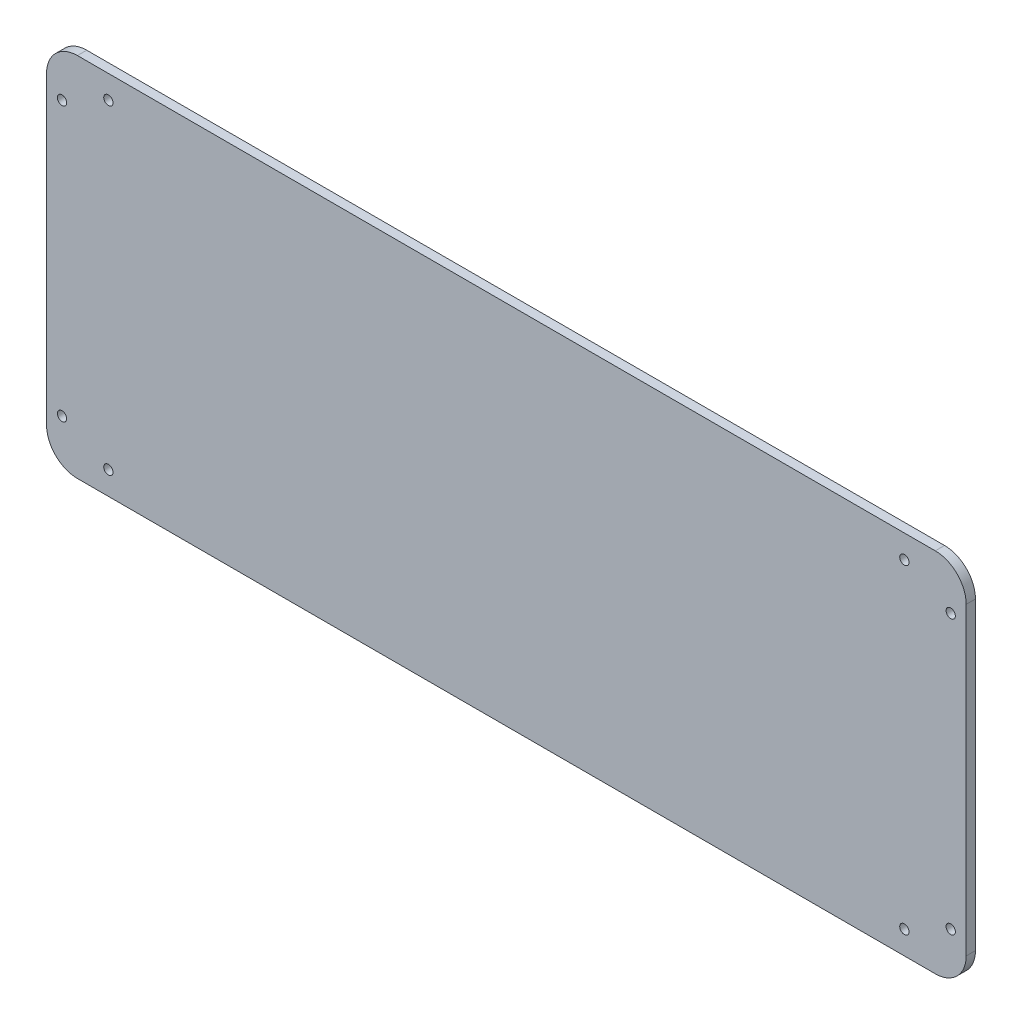
ISO-10303-21;
HEADER;
FILE_DESCRIPTION(('STEP AP214'),'2;1');
FILE_NAME('part.step','',(''),(''),'','','');
FILE_SCHEMA(('AUTOMOTIVE_DESIGN { 1 0 10303 214 1 1 1 1 }'));
ENDSEC;
DATA;
#1=APPLICATION_CONTEXT('core data for automotive mechanical design processes');
#2=APPLICATION_PROTOCOL_DEFINITION('international standard','automotive_design',2000,#1);
#3=PRODUCT_CONTEXT('',#1,'mechanical');
#4=PRODUCT('Part','Part','',(#3));
#5=PRODUCT_RELATED_PRODUCT_CATEGORY('part','',(#4));
#6=PRODUCT_DEFINITION_FORMATION('','',#4);
#7=PRODUCT_DEFINITION_CONTEXT('part definition',#1,'design');
#8=PRODUCT_DEFINITION('design','',#6,#7);
#9=PRODUCT_DEFINITION_SHAPE('','',#8);
#10=(LENGTH_UNIT() NAMED_UNIT(*) SI_UNIT(.MILLI.,.METRE.));
#11=(NAMED_UNIT(*) PLANE_ANGLE_UNIT() SI_UNIT($,.RADIAN.));
#12=(NAMED_UNIT(*) SI_UNIT($,.STERADIAN.) SOLID_ANGLE_UNIT());
#13=UNCERTAINTY_MEASURE_WITH_UNIT(LENGTH_MEASURE(1.E-05),#10,'distance_accuracy_value','');
#14=(GEOMETRIC_REPRESENTATION_CONTEXT(3) GLOBAL_UNCERTAINTY_ASSIGNED_CONTEXT((#13)) GLOBAL_UNIT_ASSIGNED_CONTEXT((#10,
#11,#12)) REPRESENTATION_CONTEXT('',''));
#15=CARTESIAN_POINT('',(0.,0.,0.));
#16=DIRECTION('',(0.,0.,1.));
#17=DIRECTION('',(1.,0.,0.));
#18=AXIS2_PLACEMENT_3D('',#15,#16,#17);
#19=CARTESIAN_POINT('',(0.,0.,3.));
#20=DIRECTION('',(1.,0.,0.));
#21=DIRECTION('',(0.,0.,-1.));
#22=AXIS2_PLACEMENT_3D('',#19,#20,#21);
#23=PLANE('',#22);
#24=DIRECTION('',(0.,-1.,0.));
#25=VECTOR('',#24,1.);
#26=CARTESIAN_POINT('',(0.,0.,0.));
#27=LINE('',#26,#25);
#28=CARTESIAN_POINT('',(0.,108.5,0.));
#29=VERTEX_POINT('',#28);
#30=CARTESIAN_POINT('',(0.,10.,0.));
#31=VERTEX_POINT('',#30);
#32=EDGE_CURVE('E157',#29,#31,#27,.T.);
#33=ORIENTED_EDGE('',*,*,#32,.T.);
#34=DIRECTION('',(0.,0.,-1.));
#35=VECTOR('',#34,1.);
#36=CARTESIAN_POINT('',(0.,10.,3.));
#37=LINE('',#36,#35);
#38=CARTESIAN_POINT('',(0.,10.,3.));
#39=VERTEX_POINT('',#38);
#40=EDGE_CURVE('E11',#31,#39,#37,.F.);
#41=ORIENTED_EDGE('',*,*,#40,.T.);
#42=DIRECTION('',(0.,-1.,0.));
#43=VECTOR('',#42,1.);
#44=CARTESIAN_POINT('',(0.,0.,3.));
#45=LINE('',#44,#43);
#46=CARTESIAN_POINT('',(0.,108.5,3.));
#47=VERTEX_POINT('',#46);
#48=EDGE_CURVE('E125',#47,#39,#45,.T.);
#49=ORIENTED_EDGE('',*,*,#48,.F.);
#50=DIRECTION('',(0.,0.,-1.));
#51=VECTOR('',#50,1.);
#52=CARTESIAN_POINT('',(0.,108.5,3.));
#53=LINE('',#52,#51);
#54=EDGE_CURVE('E41',#47,#29,#53,.T.);
#55=ORIENTED_EDGE('',*,*,#54,.T.);
#56=EDGE_LOOP('',(#33,#41,#49,#55));
#57=FACE_BOUND('',#56,.T.);
#58=ADVANCED_FACE('F33',(#57),#23,.F.);
#59=CARTESIAN_POINT('',(0.,0.,3.));
#60=DIRECTION('',(0.,1.,0.));
#61=DIRECTION('',(0.,0.,1.));
#62=AXIS2_PLACEMENT_3D('',#59,#60,#61);
#63=PLANE('',#62);
#64=DIRECTION('',(1.,0.,0.));
#65=VECTOR('',#64,1.);
#66=CARTESIAN_POINT('',(0.,0.,0.));
#67=LINE('',#66,#65);
#68=CARTESIAN_POINT('',(10.,0.,0.));
#69=VERTEX_POINT('',#68);
#70=CARTESIAN_POINT('',(287.5,0.,0.));
#71=VERTEX_POINT('',#70);
#72=EDGE_CURVE('E130',#69,#71,#67,.T.);
#73=ORIENTED_EDGE('',*,*,#72,.T.);
#74=DIRECTION('',(0.,0.,-1.));
#75=VECTOR('',#74,1.);
#76=CARTESIAN_POINT('',(287.5,0.,3.));
#77=LINE('',#76,#75);
#78=CARTESIAN_POINT('',(287.5,0.,3.));
#79=VERTEX_POINT('',#78);
#80=EDGE_CURVE('E48',#71,#79,#77,.F.);
#81=ORIENTED_EDGE('',*,*,#80,.T.);
#82=DIRECTION('',(1.,0.,0.));
#83=VECTOR('',#82,1.);
#84=CARTESIAN_POINT('',(0.,0.,3.));
#85=LINE('',#84,#83);
#86=CARTESIAN_POINT('',(10.,0.,3.));
#87=VERTEX_POINT('',#86);
#88=EDGE_CURVE('E128',#87,#79,#85,.T.);
#89=ORIENTED_EDGE('',*,*,#88,.F.);
#90=DIRECTION('',(0.,0.,-1.));
#91=VECTOR('',#90,1.);
#92=CARTESIAN_POINT('',(10.,0.,3.));
#93=LINE('',#92,#91);
#94=EDGE_CURVE('E149',#87,#69,#93,.T.);
#95=ORIENTED_EDGE('',*,*,#94,.T.);
#96=EDGE_LOOP('',(#73,#81,#89,#95));
#97=FACE_BOUND('',#96,.T.);
#98=ADVANCED_FACE('F245',(#97),#63,.F.);
#99=CARTESIAN_POINT('',(297.5,0.,3.));
#100=DIRECTION('',(-1.,0.,0.));
#101=DIRECTION('',(0.,0.,1.));
#102=AXIS2_PLACEMENT_3D('',#99,#100,#101);
#103=PLANE('',#102);
#104=DIRECTION('',(0.,1.,0.));
#105=VECTOR('',#104,1.);
#106=CARTESIAN_POINT('',(297.5,0.,0.));
#107=LINE('',#106,#105);
#108=CARTESIAN_POINT('',(297.5,10.,0.));
#109=VERTEX_POINT('',#108);
#110=CARTESIAN_POINT('',(297.5,108.5,0.));
#111=VERTEX_POINT('',#110);
#112=EDGE_CURVE('E126',#109,#111,#107,.T.);
#113=ORIENTED_EDGE('',*,*,#112,.T.);
#114=DIRECTION('',(0.,0.,-1.));
#115=VECTOR('',#114,1.);
#116=CARTESIAN_POINT('',(297.5,108.5,3.));
#117=LINE('',#116,#115);
#118=CARTESIAN_POINT('',(297.5,108.5,3.));
#119=VERTEX_POINT('',#118);
#120=EDGE_CURVE('E104',#111,#119,#117,.F.);
#121=ORIENTED_EDGE('',*,*,#120,.T.);
#122=DIRECTION('',(0.,1.,0.));
#123=VECTOR('',#122,1.);
#124=CARTESIAN_POINT('',(297.5,0.,3.));
#125=LINE('',#124,#123);
#126=CARTESIAN_POINT('',(297.5,10.,3.));
#127=VERTEX_POINT('',#126);
#128=EDGE_CURVE('E169',#127,#119,#125,.T.);
#129=ORIENTED_EDGE('',*,*,#128,.F.);
#130=DIRECTION('',(0.,0.,-1.));
#131=VECTOR('',#130,1.);
#132=CARTESIAN_POINT('',(297.5,10.,3.));
#133=LINE('',#132,#131);
#134=EDGE_CURVE('E109',#127,#109,#133,.T.);
#135=ORIENTED_EDGE('',*,*,#134,.T.);
#136=EDGE_LOOP('',(#113,#121,#129,#135));
#137=FACE_BOUND('',#136,.T.);
#138=ADVANCED_FACE('F242',(#137),#103,.F.);
#139=CARTESIAN_POINT('',(0.,118.5,3.));
#140=DIRECTION('',(0.,-1.,0.));
#141=DIRECTION('',(0.,0.,-1.));
#142=AXIS2_PLACEMENT_3D('',#139,#140,#141);
#143=PLANE('',#142);
#144=DIRECTION('',(-1.,0.,0.));
#145=VECTOR('',#144,1.);
#146=CARTESIAN_POINT('',(0.,118.5,3.));
#147=LINE('',#146,#145);
#148=CARTESIAN_POINT('',(287.5,118.5,3.));
#149=VERTEX_POINT('',#148);
#150=CARTESIAN_POINT('',(10.,118.5,3.));
#151=VERTEX_POINT('',#150);
#152=EDGE_CURVE('E119',#149,#151,#147,.T.);
#153=ORIENTED_EDGE('',*,*,#152,.F.);
#154=DIRECTION('',(0.,0.,-1.));
#155=VECTOR('',#154,1.);
#156=CARTESIAN_POINT('',(287.5,118.5,3.));
#157=LINE('',#156,#155);
#158=CARTESIAN_POINT('',(287.5,118.5,0.));
#159=VERTEX_POINT('',#158);
#160=EDGE_CURVE('E103',#149,#159,#157,.T.);
#161=ORIENTED_EDGE('',*,*,#160,.T.);
#162=DIRECTION('',(-1.,0.,0.));
#163=VECTOR('',#162,1.);
#164=CARTESIAN_POINT('',(0.,118.5,0.));
#165=LINE('',#164,#163);
#166=CARTESIAN_POINT('',(10.,118.5,0.));
#167=VERTEX_POINT('',#166);
#168=EDGE_CURVE('E116',#159,#167,#165,.T.);
#169=ORIENTED_EDGE('',*,*,#168,.T.);
#170=DIRECTION('',(0.,0.,-1.));
#171=VECTOR('',#170,1.);
#172=CARTESIAN_POINT('',(10.,118.5,3.));
#173=LINE('',#172,#171);
#174=EDGE_CURVE('E121',#167,#151,#173,.F.);
#175=ORIENTED_EDGE('',*,*,#174,.T.);
#176=EDGE_LOOP('',(#153,#161,#169,#175));
#177=FACE_BOUND('',#176,.T.);
#178=ADVANCED_FACE('F115',(#177),#143,.F.);
#179=CARTESIAN_POINT('',(0.,0.,3.));
#180=DIRECTION('',(0.,0.,-1.));
#181=DIRECTION('',(-1.,0.,0.));
#182=AXIS2_PLACEMENT_3D('',#179,#180,#181);
#183=PLANE('',#182);
#184=CARTESIAN_POINT('',(292.5,15.,3.));
#185=DIRECTION('',(0.,0.,1.));
#186=DIRECTION('',(1.,0.,0.));
#187=AXIS2_PLACEMENT_3D('',#184,#185,#186);
#188=CIRCLE('',#187,1.50000000000002);
#189=CARTESIAN_POINT('',(294.,15.,3.));
#190=VERTEX_POINT('',#189);
#191=EDGE_CURVE('E188',#190,#190,#188,.T.);
#192=ORIENTED_EDGE('',*,*,#191,.F.);
#193=EDGE_LOOP('',(#192));
#194=FACE_BOUND('',#193,.T.);
#195=CARTESIAN_POINT('',(5.,103.5,3.));
#196=DIRECTION('',(0.,0.,1.));
#197=DIRECTION('',(1.,0.,0.));
#198=AXIS2_PLACEMENT_3D('',#195,#196,#197);
#199=CIRCLE('',#198,1.5);
#200=CARTESIAN_POINT('',(6.5,103.5,3.));
#201=VERTEX_POINT('',#200);
#202=EDGE_CURVE('E195',#201,#201,#199,.T.);
#203=ORIENTED_EDGE('',*,*,#202,.F.);
#204=EDGE_LOOP('',(#203));
#205=FACE_BOUND('',#204,.T.);
#206=CARTESIAN_POINT('',(19.9999999999999,111.,3.));
#207=DIRECTION('',(0.,0.,1.));
#208=DIRECTION('',(1.,0.,0.));
#209=AXIS2_PLACEMENT_3D('',#206,#207,#208);
#210=CIRCLE('',#209,1.5);
#211=CARTESIAN_POINT('',(21.4999999999999,111.,3.));
#212=VERTEX_POINT('',#211);
#213=EDGE_CURVE('E176',#212,#212,#210,.T.);
#214=ORIENTED_EDGE('',*,*,#213,.F.);
#215=EDGE_LOOP('',(#214));
#216=FACE_BOUND('',#215,.T.);
#217=CARTESIAN_POINT('',(19.9999999999999,7.50000000000001,3.));
#218=DIRECTION('',(0.,0.,1.));
#219=DIRECTION('',(1.,0.,0.));
#220=AXIS2_PLACEMENT_3D('',#217,#218,#219);
#221=CIRCLE('',#220,1.5);
#222=CARTESIAN_POINT('',(21.4999999999999,7.50000000000001,3.));
#223=VERTEX_POINT('',#222);
#224=EDGE_CURVE('E183',#223,#223,#221,.T.);
#225=ORIENTED_EDGE('',*,*,#224,.F.);
#226=EDGE_LOOP('',(#225));
#227=FACE_BOUND('',#226,.T.);
#228=CARTESIAN_POINT('',(277.5,7.50000000000006,3.));
#229=DIRECTION('',(0.,0.,1.));
#230=DIRECTION('',(1.,0.,0.));
#231=AXIS2_PLACEMENT_3D('',#228,#229,#230);
#232=CIRCLE('',#231,1.50000000000002);
#233=CARTESIAN_POINT('',(279.,7.50000000000006,3.));
#234=VERTEX_POINT('',#233);
#235=EDGE_CURVE('E212',#234,#234,#232,.T.);
#236=ORIENTED_EDGE('',*,*,#235,.F.);
#237=EDGE_LOOP('',(#236));
#238=FACE_BOUND('',#237,.T.);
#239=CARTESIAN_POINT('',(292.5,103.5,3.));
#240=DIRECTION('',(0.,0.,1.));
#241=DIRECTION('',(1.,0.,0.));
#242=AXIS2_PLACEMENT_3D('',#239,#240,#241);
#243=CIRCLE('',#242,1.50000000000002);
#244=CARTESIAN_POINT('',(294.,103.5,3.));
#245=VERTEX_POINT('',#244);
#246=EDGE_CURVE('E206',#245,#245,#243,.T.);
#247=ORIENTED_EDGE('',*,*,#246,.F.);
#248=EDGE_LOOP('',(#247));
#249=FACE_BOUND('',#248,.T.);
#250=CARTESIAN_POINT('',(277.5,111.,3.));
#251=DIRECTION('',(0.,0.,1.));
#252=DIRECTION('',(1.,0.,0.));
#253=AXIS2_PLACEMENT_3D('',#250,#251,#252);
#254=CIRCLE('',#253,1.50000000000002);
#255=CARTESIAN_POINT('',(279.,111.,3.));
#256=VERTEX_POINT('',#255);
#257=EDGE_CURVE('E200',#256,#256,#254,.T.);
#258=ORIENTED_EDGE('',*,*,#257,.F.);
#259=EDGE_LOOP('',(#258));
#260=FACE_BOUND('',#259,.T.);
#261=CARTESIAN_POINT('',(5.00000000000013,15.,3.));
#262=DIRECTION('',(0.,0.,1.));
#263=DIRECTION('',(1.,0.,0.));
#264=AXIS2_PLACEMENT_3D('',#261,#262,#263);
#265=CIRCLE('',#264,1.5);
#266=CARTESIAN_POINT('',(6.50000000000013,15.,3.));
#267=VERTEX_POINT('',#266);
#268=EDGE_CURVE('E165',#267,#267,#265,.T.);
#269=ORIENTED_EDGE('',*,*,#268,.F.);
#270=EDGE_LOOP('',(#269));
#271=FACE_BOUND('',#270,.T.);
#272=ORIENTED_EDGE('',*,*,#128,.T.);
#273=CARTESIAN_POINT('',(287.5,108.5,3.));
#274=DIRECTION('',(0.,0.,-1.));
#275=DIRECTION('',(-1.,0.,0.));
#276=AXIS2_PLACEMENT_3D('',#273,#274,#275);
#277=CIRCLE('',#276,10.);
#278=EDGE_CURVE('E147',#119,#149,#277,.F.);
#279=ORIENTED_EDGE('',*,*,#278,.T.);
#280=ORIENTED_EDGE('',*,*,#152,.T.);
#281=CARTESIAN_POINT('',(10.,108.5,3.));
#282=DIRECTION('',(0.,0.,-1.));
#283=DIRECTION('',(-1.,0.,0.));
#284=AXIS2_PLACEMENT_3D('',#281,#282,#283);
#285=CIRCLE('',#284,10.);
#286=EDGE_CURVE('E142',#151,#47,#285,.F.);
#287=ORIENTED_EDGE('',*,*,#286,.T.);
#288=ORIENTED_EDGE('',*,*,#48,.T.);
#289=CARTESIAN_POINT('',(10.,10.,3.));
#290=DIRECTION('',(0.,0.,-1.));
#291=DIRECTION('',(-1.,0.,0.));
#292=AXIS2_PLACEMENT_3D('',#289,#290,#291);
#293=CIRCLE('',#292,10.);
#294=EDGE_CURVE('E55',#39,#87,#293,.F.);
#295=ORIENTED_EDGE('',*,*,#294,.T.);
#296=ORIENTED_EDGE('',*,*,#88,.T.);
#297=CARTESIAN_POINT('',(287.5,10.,3.));
#298=DIRECTION('',(0.,0.,-1.));
#299=DIRECTION('',(-1.,0.,0.));
#300=AXIS2_PLACEMENT_3D('',#297,#298,#299);
#301=CIRCLE('',#300,10.);
#302=EDGE_CURVE('E145',#79,#127,#301,.F.);
#303=ORIENTED_EDGE('',*,*,#302,.T.);
#304=EDGE_LOOP('',(#272,#279,#280,#287,#288,#295,#296,#303));
#305=FACE_BOUND('',#304,.T.);
#306=ADVANCED_FACE('F228',(#194,#205,#216,#227,#238,#249,#260,#271,#305),#183,.F.);
#307=CARTESIAN_POINT('',(0.,0.,0.));
#308=DIRECTION('',(0.,0.,-1.));
#309=DIRECTION('',(-1.,0.,0.));
#310=AXIS2_PLACEMENT_3D('',#307,#308,#309);
#311=PLANE('',#310);
#312=CARTESIAN_POINT('',(292.5,15.,0.));
#313=DIRECTION('',(0.,0.,1.));
#314=DIRECTION('',(1.,0.,0.));
#315=AXIS2_PLACEMENT_3D('',#312,#313,#314);
#316=CIRCLE('',#315,1.50000000000002);
#317=CARTESIAN_POINT('',(294.,15.,0.));
#318=VERTEX_POINT('',#317);
#319=EDGE_CURVE('E191',#318,#318,#316,.T.);
#320=ORIENTED_EDGE('',*,*,#319,.T.);
#321=EDGE_LOOP('',(#320));
#322=FACE_BOUND('',#321,.T.);
#323=CARTESIAN_POINT('',(5.,103.5,0.));
#324=DIRECTION('',(0.,0.,1.));
#325=DIRECTION('',(1.,0.,0.));
#326=AXIS2_PLACEMENT_3D('',#323,#324,#325);
#327=CIRCLE('',#326,1.5);
#328=CARTESIAN_POINT('',(6.5,103.5,0.));
#329=VERTEX_POINT('',#328);
#330=EDGE_CURVE('E180',#329,#329,#327,.T.);
#331=ORIENTED_EDGE('',*,*,#330,.T.);
#332=EDGE_LOOP('',(#331));
#333=FACE_BOUND('',#332,.T.);
#334=CARTESIAN_POINT('',(19.9999999999999,111.,0.));
#335=DIRECTION('',(0.,0.,1.));
#336=DIRECTION('',(1.,0.,0.));
#337=AXIS2_PLACEMENT_3D('',#334,#335,#336);
#338=CIRCLE('',#337,1.5);
#339=CARTESIAN_POINT('',(21.4999999999999,111.,0.));
#340=VERTEX_POINT('',#339);
#341=EDGE_CURVE('E179',#340,#340,#338,.T.);
#342=ORIENTED_EDGE('',*,*,#341,.T.);
#343=EDGE_LOOP('',(#342));
#344=FACE_BOUND('',#343,.T.);
#345=CARTESIAN_POINT('',(19.9999999999999,7.50000000000001,0.));
#346=DIRECTION('',(0.,0.,1.));
#347=DIRECTION('',(1.,0.,0.));
#348=AXIS2_PLACEMENT_3D('',#345,#346,#347);
#349=CIRCLE('',#348,1.5);
#350=CARTESIAN_POINT('',(21.4999999999999,7.50000000000001,0.));
#351=VERTEX_POINT('',#350);
#352=EDGE_CURVE('E174',#351,#351,#349,.T.);
#353=ORIENTED_EDGE('',*,*,#352,.T.);
#354=EDGE_LOOP('',(#353));
#355=FACE_BOUND('',#354,.T.);
#356=CARTESIAN_POINT('',(277.5,7.50000000000006,0.));
#357=DIRECTION('',(0.,0.,1.));
#358=DIRECTION('',(1.,0.,0.));
#359=AXIS2_PLACEMENT_3D('',#356,#357,#358);
#360=CIRCLE('',#359,1.50000000000002);
#361=CARTESIAN_POINT('',(279.,7.50000000000006,0.));
#362=VERTEX_POINT('',#361);
#363=EDGE_CURVE('E192',#362,#362,#360,.T.);
#364=ORIENTED_EDGE('',*,*,#363,.T.);
#365=EDGE_LOOP('',(#364));
#366=FACE_BOUND('',#365,.T.);
#367=CARTESIAN_POINT('',(292.5,103.5,0.));
#368=DIRECTION('',(0.,0.,1.));
#369=DIRECTION('',(1.,0.,0.));
#370=AXIS2_PLACEMENT_3D('',#367,#368,#369);
#371=CIRCLE('',#370,1.50000000000002);
#372=CARTESIAN_POINT('',(294.,103.5,0.));
#373=VERTEX_POINT('',#372);
#374=EDGE_CURVE('E209',#373,#373,#371,.T.);
#375=ORIENTED_EDGE('',*,*,#374,.T.);
#376=EDGE_LOOP('',(#375));
#377=FACE_BOUND('',#376,.T.);
#378=CARTESIAN_POINT('',(277.5,111.,0.));
#379=DIRECTION('',(0.,0.,1.));
#380=DIRECTION('',(1.,0.,0.));
#381=AXIS2_PLACEMENT_3D('',#378,#379,#380);
#382=CIRCLE('',#381,1.50000000000002);
#383=CARTESIAN_POINT('',(279.,111.,0.));
#384=VERTEX_POINT('',#383);
#385=EDGE_CURVE('E203',#384,#384,#382,.T.);
#386=ORIENTED_EDGE('',*,*,#385,.T.);
#387=EDGE_LOOP('',(#386));
#388=FACE_BOUND('',#387,.T.);
#389=CARTESIAN_POINT('',(5.00000000000013,15.,0.));
#390=DIRECTION('',(0.,0.,1.));
#391=DIRECTION('',(1.,0.,0.));
#392=AXIS2_PLACEMENT_3D('',#389,#390,#391);
#393=CIRCLE('',#392,1.5);
#394=CARTESIAN_POINT('',(6.50000000000013,15.,0.));
#395=VERTEX_POINT('',#394);
#396=EDGE_CURVE('E162',#395,#395,#393,.T.);
#397=ORIENTED_EDGE('',*,*,#396,.T.);
#398=EDGE_LOOP('',(#397));
#399=FACE_BOUND('',#398,.T.);
#400=ORIENTED_EDGE('',*,*,#168,.F.);
#401=CARTESIAN_POINT('',(287.5,108.5,0.));
#402=DIRECTION('',(0.,0.,-1.));
#403=DIRECTION('',(-1.,0.,0.));
#404=AXIS2_PLACEMENT_3D('',#401,#402,#403);
#405=CIRCLE('',#404,10.);
#406=EDGE_CURVE('E99',#159,#111,#405,.T.);
#407=ORIENTED_EDGE('',*,*,#406,.T.);
#408=ORIENTED_EDGE('',*,*,#112,.F.);
#409=CARTESIAN_POINT('',(287.5,10.,0.));
#410=DIRECTION('',(0.,0.,-1.));
#411=DIRECTION('',(-1.,0.,0.));
#412=AXIS2_PLACEMENT_3D('',#409,#410,#411);
#413=CIRCLE('',#412,10.);
#414=EDGE_CURVE('E110',#109,#71,#413,.T.);
#415=ORIENTED_EDGE('',*,*,#414,.T.);
#416=ORIENTED_EDGE('',*,*,#72,.F.);
#417=CARTESIAN_POINT('',(10.,10.,0.));
#418=DIRECTION('',(0.,0.,-1.));
#419=DIRECTION('',(-1.,0.,0.));
#420=AXIS2_PLACEMENT_3D('',#417,#418,#419);
#421=CIRCLE('',#420,10.);
#422=EDGE_CURVE('E136',#69,#31,#421,.T.);
#423=ORIENTED_EDGE('',*,*,#422,.T.);
#424=ORIENTED_EDGE('',*,*,#32,.F.);
#425=CARTESIAN_POINT('',(10.,108.5,0.));
#426=DIRECTION('',(0.,0.,-1.));
#427=DIRECTION('',(-1.,0.,0.));
#428=AXIS2_PLACEMENT_3D('',#425,#426,#427);
#429=CIRCLE('',#428,10.);
#430=EDGE_CURVE('E120',#29,#167,#429,.T.);
#431=ORIENTED_EDGE('',*,*,#430,.T.);
#432=EDGE_LOOP('',(#400,#407,#408,#415,#416,#423,#424,#431));
#433=FACE_BOUND('',#432,.T.);
#434=ADVANCED_FACE('F123',(#322,#333,#344,#355,#366,#377,#388,#399,#433),#311,.T.);
#435=CARTESIAN_POINT('',(5.00000000000013,15.,0.));
#436=DIRECTION('',(0.,0.,1.));
#437=DIRECTION('',(1.,0.,0.));
#438=AXIS2_PLACEMENT_3D('',#435,#436,#437);
#439=CYLINDRICAL_SURFACE('',#438,1.5);
#440=ORIENTED_EDGE('',*,*,#396,.F.);
#441=EDGE_LOOP('',(#440));
#442=FACE_BOUND('',#441,.T.);
#443=ORIENTED_EDGE('',*,*,#268,.T.);
#444=EDGE_LOOP('',(#443));
#445=FACE_BOUND('',#444,.T.);
#446=ADVANCED_FACE('F342',(#442,#445),#439,.F.);
#447=CARTESIAN_POINT('',(277.5,111.,0.));
#448=DIRECTION('',(0.,0.,1.));
#449=DIRECTION('',(1.,0.,0.));
#450=AXIS2_PLACEMENT_3D('',#447,#448,#449);
#451=CYLINDRICAL_SURFACE('',#450,1.50000000000002);
#452=ORIENTED_EDGE('',*,*,#385,.F.);
#453=EDGE_LOOP('',(#452));
#454=FACE_BOUND('',#453,.T.);
#455=ORIENTED_EDGE('',*,*,#257,.T.);
#456=EDGE_LOOP('',(#455));
#457=FACE_BOUND('',#456,.T.);
#458=ADVANCED_FACE('F333',(#454,#457),#451,.F.);
#459=CARTESIAN_POINT('',(292.5,103.5,0.));
#460=DIRECTION('',(0.,0.,1.));
#461=DIRECTION('',(1.,0.,0.));
#462=AXIS2_PLACEMENT_3D('',#459,#460,#461);
#463=CYLINDRICAL_SURFACE('',#462,1.50000000000002);
#464=ORIENTED_EDGE('',*,*,#374,.F.);
#465=EDGE_LOOP('',(#464));
#466=FACE_BOUND('',#465,.T.);
#467=ORIENTED_EDGE('',*,*,#246,.T.);
#468=EDGE_LOOP('',(#467));
#469=FACE_BOUND('',#468,.T.);
#470=ADVANCED_FACE('F224',(#466,#469),#463,.F.);
#471=CARTESIAN_POINT('',(277.5,7.50000000000006,0.));
#472=DIRECTION('',(0.,0.,1.));
#473=DIRECTION('',(1.,0.,0.));
#474=AXIS2_PLACEMENT_3D('',#471,#472,#473);
#475=CYLINDRICAL_SURFACE('',#474,1.50000000000002);
#476=ORIENTED_EDGE('',*,*,#363,.F.);
#477=EDGE_LOOP('',(#476));
#478=FACE_BOUND('',#477,.T.);
#479=ORIENTED_EDGE('',*,*,#235,.T.);
#480=EDGE_LOOP('',(#479));
#481=FACE_BOUND('',#480,.T.);
#482=ADVANCED_FACE('F220',(#478,#481),#475,.F.);
#483=CARTESIAN_POINT('',(19.9999999999999,7.50000000000001,0.));
#484=DIRECTION('',(0.,0.,1.));
#485=DIRECTION('',(1.,0.,0.));
#486=AXIS2_PLACEMENT_3D('',#483,#484,#485);
#487=CYLINDRICAL_SURFACE('',#486,1.5);
#488=ORIENTED_EDGE('',*,*,#352,.F.);
#489=EDGE_LOOP('',(#488));
#490=FACE_BOUND('',#489,.T.);
#491=ORIENTED_EDGE('',*,*,#224,.T.);
#492=EDGE_LOOP('',(#491));
#493=FACE_BOUND('',#492,.T.);
#494=ADVANCED_FACE('F223',(#490,#493),#487,.F.);
#495=CARTESIAN_POINT('',(19.9999999999999,111.,0.));
#496=DIRECTION('',(0.,0.,1.));
#497=DIRECTION('',(1.,0.,0.));
#498=AXIS2_PLACEMENT_3D('',#495,#496,#497);
#499=CYLINDRICAL_SURFACE('',#498,1.5);
#500=ORIENTED_EDGE('',*,*,#341,.F.);
#501=EDGE_LOOP('',(#500));
#502=FACE_BOUND('',#501,.T.);
#503=ORIENTED_EDGE('',*,*,#213,.T.);
#504=EDGE_LOOP('',(#503));
#505=FACE_BOUND('',#504,.T.);
#506=ADVANCED_FACE('F303',(#502,#505),#499,.F.);
#507=CARTESIAN_POINT('',(5.,103.5,0.));
#508=DIRECTION('',(0.,0.,1.));
#509=DIRECTION('',(1.,0.,0.));
#510=AXIS2_PLACEMENT_3D('',#507,#508,#509);
#511=CYLINDRICAL_SURFACE('',#510,1.5);
#512=ORIENTED_EDGE('',*,*,#330,.F.);
#513=EDGE_LOOP('',(#512));
#514=FACE_BOUND('',#513,.T.);
#515=ORIENTED_EDGE('',*,*,#202,.T.);
#516=EDGE_LOOP('',(#515));
#517=FACE_BOUND('',#516,.T.);
#518=ADVANCED_FACE('F294',(#514,#517),#511,.F.);
#519=CARTESIAN_POINT('',(292.5,15.,0.));
#520=DIRECTION('',(0.,0.,1.));
#521=DIRECTION('',(1.,0.,0.));
#522=AXIS2_PLACEMENT_3D('',#519,#520,#521);
#523=CYLINDRICAL_SURFACE('',#522,1.50000000000002);
#524=ORIENTED_EDGE('',*,*,#319,.F.);
#525=EDGE_LOOP('',(#524));
#526=FACE_BOUND('',#525,.T.);
#527=ORIENTED_EDGE('',*,*,#191,.T.);
#528=EDGE_LOOP('',(#527));
#529=FACE_BOUND('',#528,.T.);
#530=ADVANCED_FACE('F263',(#526,#529),#523,.F.);
#531=CARTESIAN_POINT('',(287.5,108.5,3.));
#532=DIRECTION('',(0.,0.,-1.));
#533=DIRECTION('',(-1.,0.,0.));
#534=AXIS2_PLACEMENT_3D('',#531,#532,#533);
#535=CYLINDRICAL_SURFACE('',#534,10.);
#536=ORIENTED_EDGE('',*,*,#278,.F.);
#537=ORIENTED_EDGE('',*,*,#120,.F.);
#538=ORIENTED_EDGE('',*,*,#406,.F.);
#539=ORIENTED_EDGE('',*,*,#160,.F.);
#540=EDGE_LOOP('',(#536,#537,#538,#539));
#541=FACE_BOUND('',#540,.T.);
#542=ADVANCED_FACE('F102',(#541),#535,.T.);
#543=CARTESIAN_POINT('',(287.5,10.,3.));
#544=DIRECTION('',(0.,0.,-1.));
#545=DIRECTION('',(-1.,0.,0.));
#546=AXIS2_PLACEMENT_3D('',#543,#544,#545);
#547=CYLINDRICAL_SURFACE('',#546,10.);
#548=ORIENTED_EDGE('',*,*,#302,.F.);
#549=ORIENTED_EDGE('',*,*,#80,.F.);
#550=ORIENTED_EDGE('',*,*,#414,.F.);
#551=ORIENTED_EDGE('',*,*,#134,.F.);
#552=EDGE_LOOP('',(#548,#549,#550,#551));
#553=FACE_BOUND('',#552,.T.);
#554=ADVANCED_FACE('F244',(#553),#547,.T.);
#555=CARTESIAN_POINT('',(10.,10.,3.));
#556=DIRECTION('',(0.,0.,-1.));
#557=DIRECTION('',(-1.,0.,0.));
#558=AXIS2_PLACEMENT_3D('',#555,#556,#557);
#559=CYLINDRICAL_SURFACE('',#558,10.);
#560=ORIENTED_EDGE('',*,*,#294,.F.);
#561=ORIENTED_EDGE('',*,*,#40,.F.);
#562=ORIENTED_EDGE('',*,*,#422,.F.);
#563=ORIENTED_EDGE('',*,*,#94,.F.);
#564=EDGE_LOOP('',(#560,#561,#562,#563));
#565=FACE_BOUND('',#564,.T.);
#566=ADVANCED_FACE('F248',(#565),#559,.T.);
#567=CARTESIAN_POINT('',(10.,108.5,3.));
#568=DIRECTION('',(0.,0.,-1.));
#569=DIRECTION('',(-1.,0.,0.));
#570=AXIS2_PLACEMENT_3D('',#567,#568,#569);
#571=CYLINDRICAL_SURFACE('',#570,10.);
#572=ORIENTED_EDGE('',*,*,#286,.F.);
#573=ORIENTED_EDGE('',*,*,#174,.F.);
#574=ORIENTED_EDGE('',*,*,#430,.F.);
#575=ORIENTED_EDGE('',*,*,#54,.F.);
#576=EDGE_LOOP('',(#572,#573,#574,#575));
#577=FACE_BOUND('',#576,.T.);
#578=ADVANCED_FACE('F35',(#577),#571,.T.);
#579=CLOSED_SHELL('',(#58,#98,#138,#178,#306,#434,#446,#458,#470,#482,#494,#506,#518,#530,#542,
#554,#566,#578));
#580=MANIFOLD_SOLID_BREP('B2',#579);
#581=ADVANCED_BREP_SHAPE_REPRESENTATION('',(#18,#580),#14);
#582=SHAPE_DEFINITION_REPRESENTATION(#9,#581);
ENDSEC;
END-ISO-10303-21;
